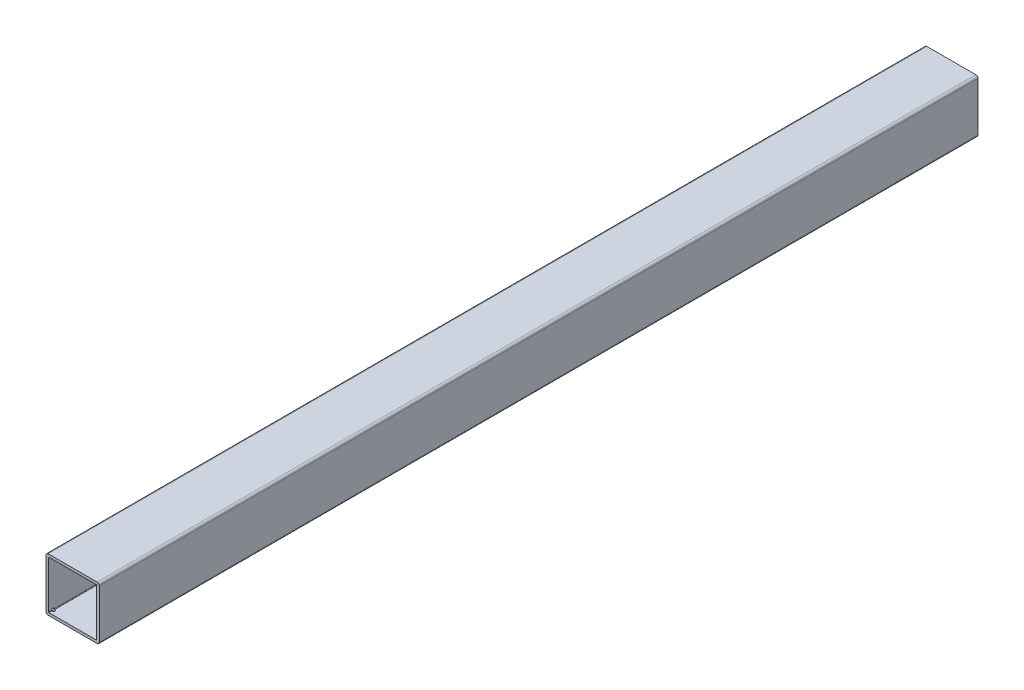
ISO-10303-21;
HEADER;
FILE_DESCRIPTION(('STEP AP214'),'2;1');
FILE_NAME('part.step','',(''),(''),'','','');
FILE_SCHEMA(('AUTOMOTIVE_DESIGN { 1 0 10303 214 1 1 1 1 }'));
ENDSEC;
DATA;
#1=APPLICATION_CONTEXT('core data for automotive mechanical design processes');
#2=APPLICATION_PROTOCOL_DEFINITION('international standard','automotive_design',2000,#1);
#3=PRODUCT_CONTEXT('',#1,'mechanical');
#4=PRODUCT('Part','Part','',(#3));
#5=PRODUCT_RELATED_PRODUCT_CATEGORY('part','',(#4));
#6=PRODUCT_DEFINITION_FORMATION('','',#4);
#7=PRODUCT_DEFINITION_CONTEXT('part definition',#1,'design');
#8=PRODUCT_DEFINITION('design','',#6,#7);
#9=PRODUCT_DEFINITION_SHAPE('','',#8);
#10=(LENGTH_UNIT() NAMED_UNIT(*) SI_UNIT(.MILLI.,.METRE.));
#11=(NAMED_UNIT(*) PLANE_ANGLE_UNIT() SI_UNIT($,.RADIAN.));
#12=(NAMED_UNIT(*) SI_UNIT($,.STERADIAN.) SOLID_ANGLE_UNIT());
#13=UNCERTAINTY_MEASURE_WITH_UNIT(LENGTH_MEASURE(1.E-05),#10,'distance_accuracy_value','');
#14=(GEOMETRIC_REPRESENTATION_CONTEXT(3) GLOBAL_UNCERTAINTY_ASSIGNED_CONTEXT((#13)) GLOBAL_UNIT_ASSIGNED_CONTEXT((#10,
#11,#12)) REPRESENTATION_CONTEXT('',''));
#15=CARTESIAN_POINT('',(0.,0.,0.));
#16=DIRECTION('',(0.,0.,1.));
#17=DIRECTION('',(1.,0.,0.));
#18=AXIS2_PLACEMENT_3D('',#15,#16,#17);
#19=CARTESIAN_POINT('',(-1270.,595.,-925.));
#20=DIRECTION('',(-1.,0.,0.));
#21=DIRECTION('',(0.,0.,1.));
#22=AXIS2_PLACEMENT_3D('',#19,#20,#21);
#23=PLANE('',#22);
#24=DIRECTION('',(0.,-1.,0.));
#25=VECTOR('',#24,1.);
#26=CARTESIAN_POINT('',(-1270.,508.,-819.4));
#27=LINE('',#26,#25);
#28=CARTESIAN_POINT('',(-1270.,506.,-819.4));
#29=VERTEX_POINT('',#28);
#30=CARTESIAN_POINT('',(-1270.,508.,-819.4));
#31=VERTEX_POINT('',#30);
#32=EDGE_CURVE('E413',#29,#31,#27,.F.);
#33=ORIENTED_EDGE('',*,*,#32,.F.);
#34=DIRECTION('',(0.,0.,1.));
#35=VECTOR('',#34,1.);
#36=CARTESIAN_POINT('',(-1270.,506.,-825.));
#37=LINE('',#36,#35);
#38=CARTESIAN_POINT('',(-1270.,506.,-825.));
#39=VERTEX_POINT('',#38);
#40=EDGE_CURVE('E448',#29,#39,#37,.F.);
#41=ORIENTED_EDGE('',*,*,#40,.T.);
#42=DIRECTION('',(0.,-1.,0.));
#43=VECTOR('',#42,1.);
#44=CARTESIAN_POINT('',(-1270.,100.,-825.));
#45=LINE('',#44,#43);
#46=CARTESIAN_POINT('',(-1270.,594.,-825.));
#47=VERTEX_POINT('',#46);
#48=EDGE_CURVE('E381',#47,#39,#45,.T.);
#49=ORIENTED_EDGE('',*,*,#48,.F.);
#50=DIRECTION('',(0.,0.,1.));
#51=VECTOR('',#50,1.);
#52=CARTESIAN_POINT('',(-1270.,594.,825.));
#53=LINE('',#52,#51);
#54=CARTESIAN_POINT('',(-1270.,594.,825.));
#55=VERTEX_POINT('',#54);
#56=EDGE_CURVE('E445',#47,#55,#53,.T.);
#57=ORIENTED_EDGE('',*,*,#56,.T.);
#58=DIRECTION('',(0.,1.,0.));
#59=VECTOR('',#58,1.);
#60=CARTESIAN_POINT('',(-1270.,100.,825.));
#61=LINE('',#60,#59);
#62=CARTESIAN_POINT('',(-1270.,506.,825.));
#63=VERTEX_POINT('',#62);
#64=EDGE_CURVE('E345',#63,#55,#61,.T.);
#65=ORIENTED_EDGE('',*,*,#64,.F.);
#66=CARTESIAN_POINT('',(-1270.,506.,819.4));
#67=VERTEX_POINT('',#66);
#68=EDGE_CURVE('E449',#63,#67,#37,.F.);
#69=ORIENTED_EDGE('',*,*,#68,.T.);
#70=DIRECTION('',(0.,-1.,0.));
#71=VECTOR('',#70,1.);
#72=CARTESIAN_POINT('',(-1270.,508.,819.4));
#73=LINE('',#72,#71);
#74=CARTESIAN_POINT('',(-1270.,508.,819.4));
#75=VERTEX_POINT('',#74);
#76=EDGE_CURVE('E199',#75,#67,#73,.T.);
#77=ORIENTED_EDGE('',*,*,#76,.F.);
#78=DIRECTION('',(0.,0.,1.));
#79=VECTOR('',#78,1.);
#80=CARTESIAN_POINT('',(-1270.,508.,-925.));
#81=LINE('',#80,#79);
#82=CARTESIAN_POINT('',(-1270.,508.,814.6));
#83=VERTEX_POINT('',#82);
#84=EDGE_CURVE('E27',#83,#75,#81,.T.);
#85=ORIENTED_EDGE('',*,*,#84,.F.);
#86=DIRECTION('',(0.,-1.,0.));
#87=VECTOR('',#86,1.);
#88=CARTESIAN_POINT('',(-1270.,508.,814.6));
#89=LINE('',#88,#87);
#90=CARTESIAN_POINT('',(-1270.,506.,814.6));
#91=VERTEX_POINT('',#90);
#92=EDGE_CURVE('E180',#91,#83,#89,.F.);
#93=ORIENTED_EDGE('',*,*,#92,.F.);
#94=CARTESIAN_POINT('',(-1270.,506.,-814.6));
#95=VERTEX_POINT('',#94);
#96=EDGE_CURVE('E415',#91,#95,#37,.F.);
#97=ORIENTED_EDGE('',*,*,#96,.T.);
#98=DIRECTION('',(0.,-1.,0.));
#99=VECTOR('',#98,1.);
#100=CARTESIAN_POINT('',(-1270.,508.,-814.6));
#101=LINE('',#100,#99);
#102=CARTESIAN_POINT('',(-1270.,508.,-814.6));
#103=VERTEX_POINT('',#102);
#104=EDGE_CURVE('E398',#103,#95,#101,.T.);
#105=ORIENTED_EDGE('',*,*,#104,.F.);
#106=DIRECTION('',(0.,0.,-1.));
#107=VECTOR('',#106,1.);
#108=CARTESIAN_POINT('',(-1270.,508.,-925.));
#109=LINE('',#108,#107);
#110=EDGE_CURVE('E12',#103,#31,#109,.T.);
#111=ORIENTED_EDGE('',*,*,#110,.T.);
#112=EDGE_LOOP('',(#33,#41,#49,#57,#65,#69,#77,#85,#93,#97,#105,#111));
#113=FACE_BOUND('',#112,.T.);
#114=ADVANCED_FACE('F19',(#113),#23,.F.);
#115=CARTESIAN_POINT('',(-1271.,504.,825.));
#116=DIRECTION('',(0.,0.,1.));
#117=DIRECTION('',(1.,0.,0.));
#118=AXIS2_PLACEMENT_3D('',#115,#116,#117);
#119=CYLINDRICAL_SURFACE('',#118,4.);
#120=DIRECTION('',(0.,0.,-1.));
#121=VECTOR('',#120,1.);
#122=CARTESIAN_POINT('',(-1271.,500.,-825.));
#123=LINE('',#122,#121);
#124=CARTESIAN_POINT('',(-1271.,500.,-818.661324772584));
#125=VERTEX_POINT('',#124);
#126=CARTESIAN_POINT('',(-1271.,500.,-825.));
#127=VERTEX_POINT('',#126);
#128=EDGE_CURVE('E294',#125,#127,#123,.T.);
#129=ORIENTED_EDGE('',*,*,#128,.F.);
#130=CARTESIAN_POINT('',(-1271.,500.,-818.661324772584));
#131=CARTESIAN_POINT('',(-1271.04662499454,500.000002773726,-818.605195062226));
#132=CARTESIAN_POINT('',(-1271.09085769348,500.000814596316,-818.547134918306));
#133=CARTESIAN_POINT('',(-1271.17427283019,500.003579997522,-818.427535082644));
#134=CARTESIAN_POINT('',(-1271.21345628017,500.005533346865,-818.365996091862));
#135=CARTESIAN_POINT('',(-1271.32297788215,500.012386882319,-818.176841294805));
#136=CARTESIAN_POINT('',(-1271.38539465559,500.018282732757,-818.044558106356));
#137=CARTESIAN_POINT('',(-1271.48719961571,500.02944845611,-817.771433379579));
#138=CARTESIAN_POINT('',(-1271.5265839814,500.034718225045,-817.630590425494));
#139=CARTESIAN_POINT('',(-1271.5812168886,500.042354461187,-817.344278951716));
#140=CARTESIAN_POINT('',(-1271.59648021106,500.044722706197,-817.198813320518));
#141=CARTESIAN_POINT('',(-1271.60242875833,500.045623870652,-816.907702429699));
#142=CARTESIAN_POINT('',(-1271.59316930317,500.044165422663,-816.762058313953));
#143=CARTESIAN_POINT('',(-1271.5504527553,500.037998473531,-816.474297706073));
#144=CARTESIAN_POINT('',(-1271.51697314742,500.033286948499,-816.33218462364));
#145=CARTESIAN_POINT('',(-1271.42685399839,500.022583750266,-816.055806342261));
#146=CARTESIAN_POINT('',(-1271.37024586477,500.016593818334,-815.9215307818));
#147=CARTESIAN_POINT('',(-1271.23547968072,500.006370595764,-815.664490637124));
#148=CARTESIAN_POINT('',(-1271.15737691937,500.002132867113,-815.541697588566));
#149=CARTESIAN_POINT('',(-1271.04709950854,500.000214063806,-815.396629787842));
#150=CARTESIAN_POINT('',(-1271.02385724197,500.000001052733,-815.3673881213));
#151=CARTESIAN_POINT('',(-1271.,500.,-815.338675227417));
#152=B_SPLINE_CURVE_WITH_KNOTS('',3,(#130,#131,#132,#133,#134,#135,#136,#137,#138,#139,#140,
#141,#142,#143,#144,#145,#146,#147,#148,#149,#150,#151),.UNSPECIFIED.,.F.,.F.,(4,2,2,2,2,2,2,2,
2,2,4),(0.,0.218755611716601,0.437467302000043,0.874392348785055,1.31138985930316,
1.74811948150027,2.1838647409998,2.62001559260321,3.05557612851102,3.49002660937734,
3.60204982101434),.UNSPECIFIED.);
#153=CARTESIAN_POINT('',(-1271.,500.,-815.338675227417));
#154=VERTEX_POINT('',#153);
#155=EDGE_CURVE('E296',#125,#154,#152,.T.);
#156=ORIENTED_EDGE('',*,*,#155,.T.);
#157=CARTESIAN_POINT('',(-1271.,500.,815.338675227417));
#158=VERTEX_POINT('',#157);
#159=EDGE_CURVE('E303',#158,#154,#123,.T.);
#160=ORIENTED_EDGE('',*,*,#159,.F.);
#161=CARTESIAN_POINT('',(-1271.,500.,815.338675227417));
#162=CARTESIAN_POINT('',(-1271.04662499454,500.000002773726,815.394804937775));
#163=CARTESIAN_POINT('',(-1271.09085769348,500.000814596316,815.452865081695));
#164=CARTESIAN_POINT('',(-1271.17427283019,500.003579997522,815.572464917357));
#165=CARTESIAN_POINT('',(-1271.21345628017,500.005533346865,815.634003908139));
#166=CARTESIAN_POINT('',(-1271.32297788215,500.012386882319,815.823158705195));
#167=CARTESIAN_POINT('',(-1271.38539465559,500.018282732757,815.955441893645));
#168=CARTESIAN_POINT('',(-1271.48719961571,500.02944845611,816.228566620421));
#169=CARTESIAN_POINT('',(-1271.5265839814,500.034718225045,816.369409574507));
#170=CARTESIAN_POINT('',(-1271.5812168886,500.042354461187,816.655721048284));
#171=CARTESIAN_POINT('',(-1271.59648021106,500.044722706197,816.801186679483));
#172=CARTESIAN_POINT('',(-1271.60242875833,500.045623870652,817.092297570301));
#173=CARTESIAN_POINT('',(-1271.59316930317,500.044165422663,817.237941686048));
#174=CARTESIAN_POINT('',(-1271.5504527553,500.037998473531,817.525702293928));
#175=CARTESIAN_POINT('',(-1271.51697314742,500.033286948499,817.667815376361));
#176=CARTESIAN_POINT('',(-1271.42685399839,500.022583750266,817.944193657739));
#177=CARTESIAN_POINT('',(-1271.37024586477,500.016593818334,818.078469218201));
#178=CARTESIAN_POINT('',(-1271.23547968072,500.006370595764,818.335509362877));
#179=CARTESIAN_POINT('',(-1271.15737691937,500.002132867113,818.458302411435));
#180=CARTESIAN_POINT('',(-1271.04709950854,500.000214063806,818.603370212158));
#181=CARTESIAN_POINT('',(-1271.02385724197,500.000001052733,818.632611878701));
#182=CARTESIAN_POINT('',(-1271.,500.,818.661324772584));
#183=B_SPLINE_CURVE_WITH_KNOTS('',3,(#161,#162,#163,#164,#165,#166,#167,#168,#169,#170,#171,
#172,#173,#174,#175,#176,#177,#178,#179,#180,#181,#182),.UNSPECIFIED.,.F.,.F.,(4,2,2,2,2,2,2,2,
2,2,4),(0.,0.218755611716601,0.437467302000043,0.874392348785055,1.31138985930284,
1.74811948150028,2.18386474099981,2.62001559260322,3.05557612851103,3.49002660937735,
3.60204982101435),.UNSPECIFIED.);
#184=CARTESIAN_POINT('',(-1271.,500.,818.661324772584));
#185=VERTEX_POINT('',#184);
#186=EDGE_CURVE('E225',#158,#185,#183,.T.);
#187=ORIENTED_EDGE('',*,*,#186,.T.);
#188=CARTESIAN_POINT('',(-1271.,500.,825.));
#189=VERTEX_POINT('',#188);
#190=EDGE_CURVE('E305',#189,#185,#123,.T.);
#191=ORIENTED_EDGE('',*,*,#190,.F.);
#192=CARTESIAN_POINT('',(-1271.,504.,825.));
#193=DIRECTION('',(0.,0.,-1.));
#194=DIRECTION('',(-1.,0.,0.));
#195=AXIS2_PLACEMENT_3D('',#192,#193,#194);
#196=CIRCLE('',#195,4.);
#197=CARTESIAN_POINT('',(-1275.,504.,825.));
#198=VERTEX_POINT('',#197);
#199=EDGE_CURVE('E422',#198,#189,#196,.F.);
#200=ORIENTED_EDGE('',*,*,#199,.F.);
#201=DIRECTION('',(0.,0.,-1.));
#202=VECTOR('',#201,1.);
#203=CARTESIAN_POINT('',(-1275.,504.,825.));
#204=LINE('',#203,#202);
#205=CARTESIAN_POINT('',(-1275.,504.,-825.));
#206=VERTEX_POINT('',#205);
#207=EDGE_CURVE('E423',#206,#198,#204,.F.);
#208=ORIENTED_EDGE('',*,*,#207,.F.);
#209=CARTESIAN_POINT('',(-1271.,504.,-825.));
#210=DIRECTION('',(0.,0.,1.));
#211=DIRECTION('',(1.,0.,0.));
#212=AXIS2_PLACEMENT_3D('',#209,#210,#211);
#213=CIRCLE('',#212,4.);
#214=EDGE_CURVE('E299',#127,#206,#213,.F.);
#215=ORIENTED_EDGE('',*,*,#214,.F.);
#216=EDGE_LOOP('',(#129,#156,#160,#187,#191,#200,#208,#215));
#217=FACE_BOUND('',#216,.T.);
#218=ADVANCED_FACE('F234',(#217),#119,.T.);
#219=CARTESIAN_POINT('',(-1269.,506.,-925.));
#220=DIRECTION('',(0.,0.,-1.));
#221=DIRECTION('',(-1.,0.,0.));
#222=AXIS2_PLACEMENT_3D('',#219,#220,#221);
#223=CYLINDRICAL_SURFACE('',#222,1.);
#224=CARTESIAN_POINT('',(-1270.,506.,-814.6));
#225=CARTESIAN_POINT('',(-1270.0000010608,505.972994214147,-814.600003330818));
#226=CARTESIAN_POINT('',(-1269.9989053241,505.946002562119,-814.599543605285));
#227=CARTESIAN_POINT('',(-1269.99454216188,505.892234894022,-814.597731426154));
#228=CARTESIAN_POINT('',(-1269.99127550235,505.865458805265,-814.596379287441));
#229=CARTESIAN_POINT('',(-1269.97829105853,505.785952573375,-814.591050309821));
#230=CARTESIAN_POINT('',(-1269.96538832776,505.733790890438,-814.585800287867));
#231=CARTESIAN_POINT('',(-1269.93159250057,505.632597455542,-814.572561172697));
#232=CARTESIAN_POINT('',(-1269.91070657435,505.583562940864,-814.564574538065));
#233=CARTESIAN_POINT('',(-1269.86159234319,505.489637971602,-814.546769558326));
#234=CARTESIAN_POINT('',(-1269.83335737766,505.444751326581,-814.536949553893));
#235=CARTESIAN_POINT('',(-1269.76878094534,505.358102449017,-814.516015474282));
#236=CARTESIAN_POINT('',(-1269.73211919262,505.31658845034,-814.504862158532));
#237=CARTESIAN_POINT('',(-1269.65240595484,505.240120132049,-814.482843942763));
#238=CARTESIAN_POINT('',(-1269.60935306116,505.205167262374,-814.47197910695));
#239=CARTESIAN_POINT('',(-1269.51615521284,505.141582866747,-814.45128633057));
#240=CARTESIAN_POINT('',(-1269.46580900352,505.113228078436,-814.441510596416));
#241=CARTESIAN_POINT('',(-1269.36063868312,505.065512951365,-814.424584042332));
#242=CARTESIAN_POINT('',(-1269.3058195087,505.046142850274,-814.417430375173));
#243=CARTESIAN_POINT('',(-1269.20900669045,505.021187107793,-814.408093688381));
#244=CARTESIAN_POINT('',(-1269.167680836,505.01326696,-814.405081882051));
#245=CARTESIAN_POINT('',(-1269.08424732282,505.002663431132,-814.401024372918));
#246=CARTESIAN_POINT('',(-1269.04213925445,504.999982876636,-814.399979731345));
#247=CARTESIAN_POINT('',(-1269.,505.,-814.4));
#248=B_SPLINE_CURVE_WITH_KNOTS('',3,(#224,#225,#226,#227,#228,#229,#230,#231,#232,#233,#234,
#235,#236,#237,#238,#239,#240,#241,#242,#243,#244,#245,#246,#247),.UNSPECIFIED.,.F.,.F.,(4,2,2,
2,2,2,2,2,2,2,2,4),(0.,0.0809638209627765,0.161899089418645,0.323019235343577,0.483995008242201,
0.645117187870362,0.813860986819894,0.982642032539791,1.15757298154704,1.33231341113014,
1.45850926056022,1.5847731695434),.UNSPECIFIED.);
#249=CARTESIAN_POINT('',(-1269.,505.,-814.4));
#250=VERTEX_POINT('',#249);
#251=EDGE_CURVE('E200',#95,#250,#248,.T.);
#252=ORIENTED_EDGE('',*,*,#251,.F.);
#253=ORIENTED_EDGE('',*,*,#96,.F.);
#254=CARTESIAN_POINT('',(-1269.,505.,814.4));
#255=CARTESIAN_POINT('',(-1269.02708075485,504.999999137207,814.399997739261));
#256=CARTESIAN_POINT('',(-1269.05414764753,505.001100776069,814.400423588729));
#257=CARTESIAN_POINT('',(-1269.10807021969,505.005488738495,814.402107280573));
#258=CARTESIAN_POINT('',(-1269.13492595628,505.008774449154,814.403364889537));
#259=CARTESIAN_POINT('',(-1269.21469966863,505.021841385053,814.408335413175));
#260=CARTESIAN_POINT('',(-1269.26705505041,505.034832820407,814.4132464399));
#261=CARTESIAN_POINT('',(-1269.36864831845,505.068886287683,814.42575741423));
#262=CARTESIAN_POINT('',(-1269.41788800843,505.089943599422,814.433355788989));
#263=CARTESIAN_POINT('',(-1269.51215863562,505.139459540218,814.450492018616));
#264=CARTESIAN_POINT('',(-1269.55718659663,505.167923350122,814.460031230078));
#265=CARTESIAN_POINT('',(-1269.64370806329,505.232746628897,814.480536471507));
#266=CARTESIAN_POINT('',(-1269.68499025298,505.269374717649,814.491544114334));
#267=CARTESIAN_POINT('',(-1269.76100292842,505.34892208698,814.513548105134));
#268=CARTESIAN_POINT('',(-1269.79573078798,505.391843877119,814.524544446832));
#269=CARTESIAN_POINT('',(-1269.85904327012,505.484889519729,814.545777587441));
#270=CARTESIAN_POINT('',(-1269.88731838037,505.535236202609,814.555964896562));
#271=CARTESIAN_POINT('',(-1269.93488282118,505.640395676329,814.573759672672));
#272=CARTESIAN_POINT('',(-1269.95418376774,505.695202585295,814.581370471158));
#273=CARTESIAN_POINT('',(-1269.97898363325,505.79183572109,814.591323924812));
#274=CARTESIAN_POINT('',(-1269.98683717922,505.832980225225,814.594546065646));
#275=CARTESIAN_POINT('',(-1269.99735655727,505.916071107467,814.598898496957));
#276=CARTESIAN_POINT('',(-1270.00001767663,505.958018179167,814.600026887069));
#277=CARTESIAN_POINT('',(-1270.,506.,814.6));
#278=B_SPLINE_CURVE_WITH_KNOTS('',3,(#254,#255,#256,#257,#258,#259,#260,#261,#262,#263,#264,
#265,#266,#267,#268,#269,#270,#271,#272,#273,#274,#275,#276,#277),.UNSPECIFIED.,.F.,.F.,(4,2,2,
2,2,2,2,2,2,2,2,4),(0.,0.081189480227277,0.16235618630781,0.324006172144191,0.485561703899264,
0.647230549015104,0.815318328520314,0.983473314771756,1.15850885009284,1.33331718767094,
1.4589878484893,1.58477251692345),.UNSPECIFIED.);
#279=CARTESIAN_POINT('',(-1269.,505.,814.4));
#280=VERTEX_POINT('',#279);
#281=EDGE_CURVE('E186',#280,#91,#278,.T.);
#282=ORIENTED_EDGE('',*,*,#281,.F.);
#283=DIRECTION('',(0.,0.,1.));
#284=VECTOR('',#283,1.);
#285=CARTESIAN_POINT('',(-1269.,505.,825.));
#286=LINE('',#285,#284);
#287=EDGE_CURVE('E443',#250,#280,#286,.T.);
#288=ORIENTED_EDGE('',*,*,#287,.F.);
#289=EDGE_LOOP('',(#252,#253,#282,#288));
#290=FACE_BOUND('',#289,.T.);
#291=ADVANCED_FACE('F262',(#290),#223,.F.);
#292=CARTESIAN_POINT('',(-1269.,505.,-819.6));
#293=CARTESIAN_POINT('',(-1269.02708075485,504.999999137207,-819.600002260739));
#294=CARTESIAN_POINT('',(-1269.05414764753,505.001100776069,-819.599576411271));
#295=CARTESIAN_POINT('',(-1269.10807021969,505.005488738495,-819.597892719427));
#296=CARTESIAN_POINT('',(-1269.13492595628,505.008774449154,-819.596635110464));
#297=CARTESIAN_POINT('',(-1269.21469966863,505.021841385053,-819.591664586825));
#298=CARTESIAN_POINT('',(-1269.26705505041,505.034832820407,-819.5867535601));
#299=CARTESIAN_POINT('',(-1269.36864831845,505.068886287683,-819.574242585771));
#300=CARTESIAN_POINT('',(-1269.41788800843,505.089943599422,-819.566644211012));
#301=CARTESIAN_POINT('',(-1269.51215863562,505.139459540218,-819.549507981384));
#302=CARTESIAN_POINT('',(-1269.55718659663,505.167923350122,-819.539968769923));
#303=CARTESIAN_POINT('',(-1269.64370806329,505.232746628897,-819.519463528493));
#304=CARTESIAN_POINT('',(-1269.68499025298,505.269374717649,-819.508455885666));
#305=CARTESIAN_POINT('',(-1269.76100292842,505.34892208698,-819.486451894866));
#306=CARTESIAN_POINT('',(-1269.79573078798,505.391843877119,-819.475455553169));
#307=CARTESIAN_POINT('',(-1269.85904327012,505.484889519729,-819.454222412559));
#308=CARTESIAN_POINT('',(-1269.88731838037,505.535236202609,-819.444035103439));
#309=CARTESIAN_POINT('',(-1269.93488282118,505.640395676329,-819.426240327328));
#310=CARTESIAN_POINT('',(-1269.95418376774,505.695202585295,-819.418629528843));
#311=CARTESIAN_POINT('',(-1269.97898363325,505.79183572109,-819.408676075188));
#312=CARTESIAN_POINT('',(-1269.98683717922,505.832980225225,-819.405453934355));
#313=CARTESIAN_POINT('',(-1269.99735655727,505.916071107467,-819.401101503044));
#314=CARTESIAN_POINT('',(-1270.00001767663,505.958018179167,-819.399973112932));
#315=CARTESIAN_POINT('',(-1270.,506.,-819.4));
#316=B_SPLINE_CURVE_WITH_KNOTS('',3,(#292,#293,#294,#295,#296,#297,#298,#299,#300,#301,#302,
#303,#304,#305,#306,#307,#308,#309,#310,#311,#312,#313,#314,#315),.UNSPECIFIED.,.F.,.F.,(4,2,2,
2,2,2,2,2,2,2,2,4),(0.,0.081189480227277,0.16235618630781,0.324006172144191,0.485561703899264,
0.647230549015104,0.815318328520151,0.98347331477173,1.15850885009281,1.33331718767091,
1.45898784848927,1.58477251692343),.UNSPECIFIED.);
#317=CARTESIAN_POINT('',(-1269.,505.,-819.6));
#318=VERTEX_POINT('',#317);
#319=EDGE_CURVE('E201',#318,#29,#316,.T.);
#320=ORIENTED_EDGE('',*,*,#319,.F.);
#321=CARTESIAN_POINT('',(-1269.,505.,-825.));
#322=VERTEX_POINT('',#321);
#323=EDGE_CURVE('E439',#322,#318,#286,.T.);
#324=ORIENTED_EDGE('',*,*,#323,.F.);
#325=CARTESIAN_POINT('',(-1269.,506.,-825.));
#326=DIRECTION('',(0.,0.,1.));
#327=DIRECTION('',(1.,0.,0.));
#328=AXIS2_PLACEMENT_3D('',#325,#326,#327);
#329=CIRCLE('',#328,1.);
#330=EDGE_CURVE('E462',#39,#322,#329,.T.);
#331=ORIENTED_EDGE('',*,*,#330,.F.);
#332=ORIENTED_EDGE('',*,*,#40,.F.);
#333=EDGE_LOOP('',(#320,#324,#331,#332));
#334=FACE_BOUND('',#333,.T.);
#335=ADVANCED_FACE('F266',(#334),#223,.F.);
#336=CARTESIAN_POINT('',(-1270.,506.,819.4));
#337=CARTESIAN_POINT('',(-1270.0000010608,505.972994214147,819.399996669182));
#338=CARTESIAN_POINT('',(-1269.9989053241,505.946002562119,819.400456394715));
#339=CARTESIAN_POINT('',(-1269.99454216188,505.892234894022,819.402268573846));
#340=CARTESIAN_POINT('',(-1269.99127550235,505.865458805265,819.40362071256));
#341=CARTESIAN_POINT('',(-1269.97829105853,505.785952573375,819.408949690179));
#342=CARTESIAN_POINT('',(-1269.96538832776,505.733790890438,819.414199712134));
#343=CARTESIAN_POINT('',(-1269.93159250057,505.632597455542,819.427438827303));
#344=CARTESIAN_POINT('',(-1269.91070657435,505.583562940864,819.435425461936));
#345=CARTESIAN_POINT('',(-1269.86159234319,505.489637971602,819.453230441675));
#346=CARTESIAN_POINT('',(-1269.83335737766,505.444751326581,819.463050446108));
#347=CARTESIAN_POINT('',(-1269.76878094534,505.358102449017,819.483984525718));
#348=CARTESIAN_POINT('',(-1269.73211919262,505.31658845034,819.495137841468));
#349=CARTESIAN_POINT('',(-1269.65240595484,505.240120132049,819.517156057237));
#350=CARTESIAN_POINT('',(-1269.60935306116,505.205167262374,819.52802089305));
#351=CARTESIAN_POINT('',(-1269.51615521284,505.141582866747,819.54871366943));
#352=CARTESIAN_POINT('',(-1269.46580900352,505.113228078436,819.558489403585));
#353=CARTESIAN_POINT('',(-1269.36063868312,505.065512951365,819.575415957668));
#354=CARTESIAN_POINT('',(-1269.3058195087,505.046142850274,819.582569624827));
#355=CARTESIAN_POINT('',(-1269.20900669045,505.021187107793,819.591906311619));
#356=CARTESIAN_POINT('',(-1269.167680836,505.01326696,819.59491811795));
#357=CARTESIAN_POINT('',(-1269.08424732282,505.002663431132,819.598975627083));
#358=CARTESIAN_POINT('',(-1269.04213925445,504.999982876636,819.600020268656));
#359=CARTESIAN_POINT('',(-1269.,505.,819.6));
#360=B_SPLINE_CURVE_WITH_KNOTS('',3,(#336,#337,#338,#339,#340,#341,#342,#343,#344,#345,#346,
#347,#348,#349,#350,#351,#352,#353,#354,#355,#356,#357,#358,#359),.UNSPECIFIED.,.F.,.F.,(4,2,2,
2,2,2,2,2,2,2,2,4),(0.,0.0809638209627765,0.161899089418645,0.323019235343577,0.483995008242302,
0.64511718787037,0.813860986819903,0.9826420325398,1.15757298154705,1.33231341113014,
1.45850926056023,1.58477316954341),.UNSPECIFIED.);
#361=CARTESIAN_POINT('',(-1269.,505.,819.6));
#362=VERTEX_POINT('',#361);
#363=EDGE_CURVE('E253',#67,#362,#360,.T.);
#364=ORIENTED_EDGE('',*,*,#363,.F.);
#365=ORIENTED_EDGE('',*,*,#68,.F.);
#366=CARTESIAN_POINT('',(-1269.,506.,825.));
#367=DIRECTION('',(0.,0.,-1.));
#368=DIRECTION('',(-1.,0.,0.));
#369=AXIS2_PLACEMENT_3D('',#366,#367,#368);
#370=CIRCLE('',#369,1.);
#371=CARTESIAN_POINT('',(-1269.,505.,825.));
#372=VERTEX_POINT('',#371);
#373=EDGE_CURVE('E460',#372,#63,#370,.T.);
#374=ORIENTED_EDGE('',*,*,#373,.F.);
#375=EDGE_CURVE('E438',#362,#372,#286,.T.);
#376=ORIENTED_EDGE('',*,*,#375,.F.);
#377=EDGE_LOOP('',(#364,#365,#374,#376));
#378=FACE_BOUND('',#377,.T.);
#379=ADVANCED_FACE('F268',(#378),#223,.F.);
#380=CARTESIAN_POINT('',(-1175.,100.,825.));
#381=DIRECTION('',(1.,0.,0.));
#382=DIRECTION('',(0.,0.,-1.));
#383=AXIS2_PLACEMENT_3D('',#380,#381,#382);
#384=PLANE('',#383);
#385=DIRECTION('',(0.,0.,-1.));
#386=VECTOR('',#385,1.);
#387=CARTESIAN_POINT('',(-1175.,596.,825.));
#388=LINE('',#387,#386);
#389=CARTESIAN_POINT('',(-1175.,596.,-825.));
#390=VERTEX_POINT('',#389);
#391=CARTESIAN_POINT('',(-1175.,596.,825.));
#392=VERTEX_POINT('',#391);
#393=EDGE_CURVE('E340',#390,#392,#388,.F.);
#394=ORIENTED_EDGE('',*,*,#393,.T.);
#395=DIRECTION('',(0.,1.,0.));
#396=VECTOR('',#395,1.);
#397=CARTESIAN_POINT('',(-1175.,500.,825.));
#398=LINE('',#397,#396);
#399=CARTESIAN_POINT('',(-1175.,504.,825.));
#400=VERTEX_POINT('',#399);
#401=EDGE_CURVE('E360',#392,#400,#398,.F.);
#402=ORIENTED_EDGE('',*,*,#401,.T.);
#403=DIRECTION('',(0.,0.,-1.));
#404=VECTOR('',#403,1.);
#405=CARTESIAN_POINT('',(-1175.,504.,825.));
#406=LINE('',#405,#404);
#407=CARTESIAN_POINT('',(-1175.,504.,-825.));
#408=VERTEX_POINT('',#407);
#409=EDGE_CURVE('E306',#400,#408,#406,.T.);
#410=ORIENTED_EDGE('',*,*,#409,.T.);
#411=DIRECTION('',(0.,1.,0.));
#412=VECTOR('',#411,1.);
#413=CARTESIAN_POINT('',(-1175.,500.,-825.));
#414=LINE('',#413,#412);
#415=EDGE_CURVE('E364',#408,#390,#414,.T.);
#416=ORIENTED_EDGE('',*,*,#415,.T.);
#417=EDGE_LOOP('',(#394,#402,#410,#416));
#418=FACE_BOUND('',#417,.T.);
#419=ADVANCED_FACE('F511',(#418),#384,.T.);
#420=CARTESIAN_POINT('',(-358.3,500.,825.));
#421=DIRECTION('',(0.,-1.,0.));
#422=DIRECTION('',(0.,0.,-1.));
#423=AXIS2_PLACEMENT_3D('',#420,#421,#422);
#424=PLANE('',#423);
#425=ORIENTED_EDGE('',*,*,#159,.T.);
#426=CARTESIAN_POINT('',(-1269.,500.,-817.));
#427=DIRECTION('',(0.,-1.,0.));
#428=DIRECTION('',(0.,0.,-1.));
#429=AXIS2_PLACEMENT_3D('',#426,#427,#428);
#430=CIRCLE('',#429,2.59999999999994);
#431=EDGE_CURVE('E33',#154,#125,#430,.F.);
#432=ORIENTED_EDGE('',*,*,#431,.T.);
#433=ORIENTED_EDGE('',*,*,#128,.T.);
#434=DIRECTION('',(-1.,0.,0.));
#435=VECTOR('',#434,1.);
#436=CARTESIAN_POINT('',(-1175.,500.,-825.));
#437=LINE('',#436,#435);
#438=CARTESIAN_POINT('',(-1179.,500.,-825.));
#439=VERTEX_POINT('',#438);
#440=EDGE_CURVE('E354',#127,#439,#437,.F.);
#441=ORIENTED_EDGE('',*,*,#440,.T.);
#442=DIRECTION('',(0.,0.,-1.));
#443=VECTOR('',#442,1.);
#444=CARTESIAN_POINT('',(-1179.,500.,825.));
#445=LINE('',#444,#443);
#446=CARTESIAN_POINT('',(-1179.,500.,825.));
#447=VERTEX_POINT('',#446);
#448=EDGE_CURVE('E304',#439,#447,#445,.F.);
#449=ORIENTED_EDGE('',*,*,#448,.T.);
#450=DIRECTION('',(1.,0.,0.));
#451=VECTOR('',#450,1.);
#452=CARTESIAN_POINT('',(0.,500.,825.));
#453=LINE('',#452,#451);
#454=EDGE_CURVE('E359',#189,#447,#453,.T.);
#455=ORIENTED_EDGE('',*,*,#454,.F.);
#456=ORIENTED_EDGE('',*,*,#190,.T.);
#457=CARTESIAN_POINT('',(-1269.,500.,817.));
#458=DIRECTION('',(0.,-1.,0.));
#459=DIRECTION('',(0.,0.,-1.));
#460=AXIS2_PLACEMENT_3D('',#457,#458,#459);
#461=CIRCLE('',#460,2.59999999999994);
#462=EDGE_CURVE('E40',#185,#158,#461,.F.);
#463=ORIENTED_EDGE('',*,*,#462,.T.);
#464=EDGE_LOOP('',(#425,#432,#433,#441,#449,#455,#456,#463));
#465=FACE_BOUND('',#464,.T.);
#466=ADVANCED_FACE('F420',(#465),#424,.T.);
#467=CARTESIAN_POINT('',(-1175.,100.,-825.));
#468=DIRECTION('',(0.,0.,1.));
#469=DIRECTION('',(1.,0.,0.));
#470=AXIS2_PLACEMENT_3D('',#467,#468,#469);
#471=PLANE('',#470);
#472=DIRECTION('',(-1.,0.,0.));
#473=VECTOR('',#472,1.);
#474=CARTESIAN_POINT('',(-1175.,595.,-825.));
#475=LINE('',#474,#473);
#476=CARTESIAN_POINT('',(-1181.,595.,-825.));
#477=VERTEX_POINT('',#476);
#478=CARTESIAN_POINT('',(-1269.,595.,-825.));
#479=VERTEX_POINT('',#478);
#480=EDGE_CURVE('E384',#477,#479,#475,.T.);
#481=ORIENTED_EDGE('',*,*,#480,.T.);
#482=CARTESIAN_POINT('',(-1269.,594.,-825.));
#483=DIRECTION('',(0.,0.,1.));
#484=DIRECTION('',(1.,0.,0.));
#485=AXIS2_PLACEMENT_3D('',#482,#483,#484);
#486=CIRCLE('',#485,1.);
#487=EDGE_CURVE('E466',#479,#47,#486,.T.);
#488=ORIENTED_EDGE('',*,*,#487,.T.);
#489=ORIENTED_EDGE('',*,*,#48,.T.);
#490=ORIENTED_EDGE('',*,*,#330,.T.);
#491=DIRECTION('',(1.,0.,0.));
#492=VECTOR('',#491,1.);
#493=CARTESIAN_POINT('',(-1175.,505.,-825.));
#494=LINE('',#493,#492);
#495=CARTESIAN_POINT('',(-1181.,505.,-825.));
#496=VERTEX_POINT('',#495);
#497=EDGE_CURVE('E374',#322,#496,#494,.T.);
#498=ORIENTED_EDGE('',*,*,#497,.T.);
#499=CARTESIAN_POINT('',(-1181.,506.,-825.));
#500=DIRECTION('',(0.,0.,1.));
#501=DIRECTION('',(1.,0.,0.));
#502=AXIS2_PLACEMENT_3D('',#499,#500,#501);
#503=CIRCLE('',#502,1.);
#504=CARTESIAN_POINT('',(-1180.,506.,-825.));
#505=VERTEX_POINT('',#504);
#506=EDGE_CURVE('E458',#496,#505,#503,.T.);
#507=ORIENTED_EDGE('',*,*,#506,.T.);
#508=DIRECTION('',(0.,1.,0.));
#509=VECTOR('',#508,1.);
#510=CARTESIAN_POINT('',(-1180.,100.,-825.));
#511=LINE('',#510,#509);
#512=CARTESIAN_POINT('',(-1180.,594.,-825.));
#513=VERTEX_POINT('',#512);
#514=EDGE_CURVE('E388',#505,#513,#511,.T.);
#515=ORIENTED_EDGE('',*,*,#514,.T.);
#516=CARTESIAN_POINT('',(-1181.,594.,-825.));
#517=DIRECTION('',(0.,0.,1.));
#518=DIRECTION('',(1.,0.,0.));
#519=AXIS2_PLACEMENT_3D('',#516,#517,#518);
#520=CIRCLE('',#519,1.);
#521=EDGE_CURVE('E469',#513,#477,#520,.T.);
#522=ORIENTED_EDGE('',*,*,#521,.T.);
#523=EDGE_LOOP('',(#481,#488,#489,#490,#498,#507,#515,#522));
#524=FACE_BOUND('',#523,.T.);
#525=ORIENTED_EDGE('',*,*,#415,.F.);
#526=CARTESIAN_POINT('',(-1179.,504.,-825.));
#527=DIRECTION('',(0.,0.,1.));
#528=DIRECTION('',(1.,0.,0.));
#529=AXIS2_PLACEMENT_3D('',#526,#527,#528);
#530=CIRCLE('',#529,4.);
#531=EDGE_CURVE('E324',#408,#439,#530,.F.);
#532=ORIENTED_EDGE('',*,*,#531,.T.);
#533=ORIENTED_EDGE('',*,*,#440,.F.);
#534=ORIENTED_EDGE('',*,*,#214,.T.);
#535=DIRECTION('',(0.,-1.,0.));
#536=VECTOR('',#535,1.);
#537=CARTESIAN_POINT('',(-1275.,500.,-825.));
#538=LINE('',#537,#536);
#539=CARTESIAN_POINT('',(-1275.,596.,-825.));
#540=VERTEX_POINT('',#539);
#541=EDGE_CURVE('E358',#540,#206,#538,.T.);
#542=ORIENTED_EDGE('',*,*,#541,.F.);
#543=CARTESIAN_POINT('',(-1271.,596.,-825.));
#544=DIRECTION('',(0.,0.,1.));
#545=DIRECTION('',(1.,0.,0.));
#546=AXIS2_PLACEMENT_3D('',#543,#544,#545);
#547=CIRCLE('',#546,4.);
#548=CARTESIAN_POINT('',(-1271.,600.,-825.));
#549=VERTEX_POINT('',#548);
#550=EDGE_CURVE('E311',#540,#549,#547,.F.);
#551=ORIENTED_EDGE('',*,*,#550,.T.);
#552=DIRECTION('',(1.,0.,0.));
#553=VECTOR('',#552,1.);
#554=CARTESIAN_POINT('',(-1275.,600.,-825.));
#555=LINE('',#554,#553);
#556=CARTESIAN_POINT('',(-1179.,600.,-825.));
#557=VERTEX_POINT('',#556);
#558=EDGE_CURVE('E363',#549,#557,#555,.T.);
#559=ORIENTED_EDGE('',*,*,#558,.T.);
#560=CARTESIAN_POINT('',(-1179.,596.,-825.));
#561=DIRECTION('',(0.,0.,1.));
#562=DIRECTION('',(1.,0.,0.));
#563=AXIS2_PLACEMENT_3D('',#560,#561,#562);
#564=CIRCLE('',#563,4.);
#565=EDGE_CURVE('E319',#557,#390,#564,.F.);
#566=ORIENTED_EDGE('',*,*,#565,.T.);
#567=EDGE_LOOP('',(#525,#532,#533,#534,#542,#551,#559,#566));
#568=FACE_BOUND('',#567,.T.);
#569=ADVANCED_FACE('F473',(#524,#568),#471,.F.);
#570=CARTESIAN_POINT('',(-1275.,600.,50.));
#571=DIRECTION('',(0.,1.,0.));
#572=DIRECTION('',(0.,0.,1.));
#573=AXIS2_PLACEMENT_3D('',#570,#571,#572);
#574=PLANE('',#573);
#575=ORIENTED_EDGE('',*,*,#558,.F.);
#576=DIRECTION('',(0.,0.,1.));
#577=VECTOR('',#576,1.);
#578=CARTESIAN_POINT('',(-1271.,600.,825.));
#579=LINE('',#578,#577);
#580=CARTESIAN_POINT('',(-1271.,600.,825.));
#581=VERTEX_POINT('',#580);
#582=EDGE_CURVE('E330',#549,#581,#579,.T.);
#583=ORIENTED_EDGE('',*,*,#582,.T.);
#584=DIRECTION('',(-1.,0.,0.));
#585=VECTOR('',#584,1.);
#586=CARTESIAN_POINT('',(-1275.,600.,825.));
#587=LINE('',#586,#585);
#588=CARTESIAN_POINT('',(-1179.,600.,825.));
#589=VERTEX_POINT('',#588);
#590=EDGE_CURVE('E366',#589,#581,#587,.T.);
#591=ORIENTED_EDGE('',*,*,#590,.F.);
#592=DIRECTION('',(0.,0.,-1.));
#593=VECTOR('',#592,1.);
#594=CARTESIAN_POINT('',(-1179.,600.,50.));
#595=LINE('',#594,#593);
#596=EDGE_CURVE('E327',#589,#557,#595,.T.);
#597=ORIENTED_EDGE('',*,*,#596,.T.);
#598=EDGE_LOOP('',(#575,#583,#591,#597));
#599=FACE_BOUND('',#598,.T.);
#600=ADVANCED_FACE('F524',(#599),#574,.T.);
#601=CARTESIAN_POINT('',(-1275.,100.,825.));
#602=DIRECTION('',(0.,0.,-1.));
#603=DIRECTION('',(-1.,0.,0.));
#604=AXIS2_PLACEMENT_3D('',#601,#602,#603);
#605=PLANE('',#604);
#606=DIRECTION('',(1.,0.,0.));
#607=VECTOR('',#606,1.);
#608=CARTESIAN_POINT('',(-1275.,595.,825.));
#609=LINE('',#608,#607);
#610=CARTESIAN_POINT('',(-1269.,595.,825.));
#611=VERTEX_POINT('',#610);
#612=CARTESIAN_POINT('',(-1181.,595.,825.));
#613=VERTEX_POINT('',#612);
#614=EDGE_CURVE('E347',#611,#613,#609,.T.);
#615=ORIENTED_EDGE('',*,*,#614,.T.);
#616=CARTESIAN_POINT('',(-1181.,594.,825.));
#617=DIRECTION('',(0.,0.,-1.));
#618=DIRECTION('',(-1.,0.,0.));
#619=AXIS2_PLACEMENT_3D('',#616,#617,#618);
#620=CIRCLE('',#619,1.);
#621=CARTESIAN_POINT('',(-1180.,594.,825.));
#622=VERTEX_POINT('',#621);
#623=EDGE_CURVE('E468',#613,#622,#620,.T.);
#624=ORIENTED_EDGE('',*,*,#623,.T.);
#625=DIRECTION('',(0.,-1.,0.));
#626=VECTOR('',#625,1.);
#627=CARTESIAN_POINT('',(-1180.,100.,825.));
#628=LINE('',#627,#626);
#629=CARTESIAN_POINT('',(-1180.,506.,825.));
#630=VERTEX_POINT('',#629);
#631=EDGE_CURVE('E351',#622,#630,#628,.T.);
#632=ORIENTED_EDGE('',*,*,#631,.T.);
#633=CARTESIAN_POINT('',(-1181.,506.,825.));
#634=DIRECTION('',(0.,0.,-1.));
#635=DIRECTION('',(-1.,0.,0.));
#636=AXIS2_PLACEMENT_3D('',#633,#634,#635);
#637=CIRCLE('',#636,1.);
#638=CARTESIAN_POINT('',(-1181.,505.,825.));
#639=VERTEX_POINT('',#638);
#640=EDGE_CURVE('E456',#630,#639,#637,.T.);
#641=ORIENTED_EDGE('',*,*,#640,.T.);
#642=DIRECTION('',(-1.,0.,0.));
#643=VECTOR('',#642,1.);
#644=CARTESIAN_POINT('',(-1275.,505.,825.));
#645=LINE('',#644,#643);
#646=EDGE_CURVE('E342',#639,#372,#645,.T.);
#647=ORIENTED_EDGE('',*,*,#646,.T.);
#648=ORIENTED_EDGE('',*,*,#373,.T.);
#649=ORIENTED_EDGE('',*,*,#64,.T.);
#650=CARTESIAN_POINT('',(-1269.,594.,825.));
#651=DIRECTION('',(0.,0.,-1.));
#652=DIRECTION('',(-1.,0.,0.));
#653=AXIS2_PLACEMENT_3D('',#650,#651,#652);
#654=CIRCLE('',#653,1.);
#655=EDGE_CURVE('E464',#55,#611,#654,.T.);
#656=ORIENTED_EDGE('',*,*,#655,.T.);
#657=EDGE_LOOP('',(#615,#624,#632,#641,#647,#648,#649,#656));
#658=FACE_BOUND('',#657,.T.);
#659=DIRECTION('',(0.,1.,0.));
#660=VECTOR('',#659,1.);
#661=CARTESIAN_POINT('',(-1275.,500.,825.));
#662=LINE('',#661,#660);
#663=CARTESIAN_POINT('',(-1275.,596.,825.));
#664=VERTEX_POINT('',#663);
#665=EDGE_CURVE('E355',#198,#664,#662,.T.);
#666=ORIENTED_EDGE('',*,*,#665,.F.);
#667=ORIENTED_EDGE('',*,*,#199,.T.);
#668=ORIENTED_EDGE('',*,*,#454,.T.);
#669=CARTESIAN_POINT('',(-1179.,504.,825.));
#670=DIRECTION('',(0.,0.,-1.));
#671=DIRECTION('',(-1.,0.,0.));
#672=AXIS2_PLACEMENT_3D('',#669,#670,#671);
#673=CIRCLE('',#672,4.);
#674=EDGE_CURVE('E427',#447,#400,#673,.F.);
#675=ORIENTED_EDGE('',*,*,#674,.T.);
#676=ORIENTED_EDGE('',*,*,#401,.F.);
#677=CARTESIAN_POINT('',(-1179.,596.,825.));
#678=DIRECTION('',(0.,0.,-1.));
#679=DIRECTION('',(-1.,0.,0.));
#680=AXIS2_PLACEMENT_3D('',#677,#678,#679);
#681=CIRCLE('',#680,4.);
#682=EDGE_CURVE('E544',#392,#589,#681,.F.);
#683=ORIENTED_EDGE('',*,*,#682,.T.);
#684=ORIENTED_EDGE('',*,*,#590,.T.);
#685=CARTESIAN_POINT('',(-1271.,596.,825.));
#686=DIRECTION('',(0.,0.,-1.));
#687=DIRECTION('',(-1.,0.,0.));
#688=AXIS2_PLACEMENT_3D('',#685,#686,#687);
#689=CIRCLE('',#688,4.);
#690=EDGE_CURVE('E432',#581,#664,#689,.F.);
#691=ORIENTED_EDGE('',*,*,#690,.T.);
#692=EDGE_LOOP('',(#666,#667,#668,#675,#676,#683,#684,#691));
#693=FACE_BOUND('',#692,.T.);
#694=ADVANCED_FACE('F483',(#658,#693),#605,.F.);
#695=CARTESIAN_POINT('',(-1275.,500.,0.));
#696=DIRECTION('',(1.,0.,0.));
#697=DIRECTION('',(0.,0.,-1.));
#698=AXIS2_PLACEMENT_3D('',#695,#696,#697);
#699=PLANE('',#698);
#700=ORIENTED_EDGE('',*,*,#541,.T.);
#701=ORIENTED_EDGE('',*,*,#207,.T.);
#702=ORIENTED_EDGE('',*,*,#665,.T.);
#703=DIRECTION('',(0.,0.,1.));
#704=VECTOR('',#703,1.);
#705=CARTESIAN_POINT('',(-1275.,596.,-825.));
#706=LINE('',#705,#704);
#707=EDGE_CURVE('E549',#664,#540,#706,.F.);
#708=ORIENTED_EDGE('',*,*,#707,.T.);
#709=EDGE_LOOP('',(#700,#701,#702,#708));
#710=FACE_BOUND('',#709,.T.);
#711=ADVANCED_FACE('F521',(#710),#699,.F.);
#712=CARTESIAN_POINT('',(-1270.,505.,-925.));
#713=DIRECTION('',(0.,-1.,0.));
#714=DIRECTION('',(0.,0.,-1.));
#715=AXIS2_PLACEMENT_3D('',#712,#713,#714);
#716=PLANE('',#715);
#717=CARTESIAN_POINT('',(-1269.,505.,-817.));
#718=DIRECTION('',(0.,-1.,0.));
#719=DIRECTION('',(0.,0.,-1.));
#720=AXIS2_PLACEMENT_3D('',#717,#718,#719);
#721=CIRCLE('',#720,2.59999999999994);
#722=EDGE_CURVE('E417',#250,#318,#721,.F.);
#723=ORIENTED_EDGE('',*,*,#722,.F.);
#724=ORIENTED_EDGE('',*,*,#287,.T.);
#725=CARTESIAN_POINT('',(-1269.,505.,817.));
#726=DIRECTION('',(0.,-1.,0.));
#727=DIRECTION('',(0.,0.,-1.));
#728=AXIS2_PLACEMENT_3D('',#725,#726,#727);
#729=CIRCLE('',#728,2.59999999999994);
#730=EDGE_CURVE('E191',#362,#280,#729,.F.);
#731=ORIENTED_EDGE('',*,*,#730,.F.);
#732=ORIENTED_EDGE('',*,*,#375,.T.);
#733=ORIENTED_EDGE('',*,*,#646,.F.);
#734=DIRECTION('',(0.,0.,1.));
#735=VECTOR('',#734,1.);
#736=CARTESIAN_POINT('',(-1181.,505.,-825.));
#737=LINE('',#736,#735);
#738=EDGE_CURVE('E442',#639,#496,#737,.F.);
#739=ORIENTED_EDGE('',*,*,#738,.T.);
#740=ORIENTED_EDGE('',*,*,#497,.F.);
#741=ORIENTED_EDGE('',*,*,#323,.T.);
#742=EDGE_LOOP('',(#723,#724,#731,#732,#733,#739,#740,#741));
#743=FACE_BOUND('',#742,.T.);
#744=ADVANCED_FACE('F491',(#743),#716,.F.);
#745=CARTESIAN_POINT('',(-1180.,595.,-925.));
#746=DIRECTION('',(0.,1.,0.));
#747=DIRECTION('',(0.,0.,1.));
#748=AXIS2_PLACEMENT_3D('',#745,#746,#747);
#749=PLANE('',#748);
#750=ORIENTED_EDGE('',*,*,#614,.F.);
#751=DIRECTION('',(0.,0.,1.));
#752=VECTOR('',#751,1.);
#753=CARTESIAN_POINT('',(-1269.,595.,-825.));
#754=LINE('',#753,#752);
#755=EDGE_CURVE('E454',#611,#479,#754,.F.);
#756=ORIENTED_EDGE('',*,*,#755,.T.);
#757=ORIENTED_EDGE('',*,*,#480,.F.);
#758=DIRECTION('',(0.,0.,1.));
#759=VECTOR('',#758,1.);
#760=CARTESIAN_POINT('',(-1181.,595.,825.));
#761=LINE('',#760,#759);
#762=EDGE_CURVE('E451',#477,#613,#761,.T.);
#763=ORIENTED_EDGE('',*,*,#762,.T.);
#764=EDGE_LOOP('',(#750,#756,#757,#763));
#765=FACE_BOUND('',#764,.T.);
#766=ADVANCED_FACE('F479',(#765),#749,.F.);
#767=CARTESIAN_POINT('',(-1180.,505.,-925.));
#768=DIRECTION('',(1.,0.,0.));
#769=DIRECTION('',(0.,0.,-1.));
#770=AXIS2_PLACEMENT_3D('',#767,#768,#769);
#771=PLANE('',#770);
#772=ORIENTED_EDGE('',*,*,#514,.F.);
#773=DIRECTION('',(0.,0.,1.));
#774=VECTOR('',#773,1.);
#775=CARTESIAN_POINT('',(-1180.,506.,825.));
#776=LINE('',#775,#774);
#777=EDGE_CURVE('E429',#505,#630,#776,.T.);
#778=ORIENTED_EDGE('',*,*,#777,.T.);
#779=ORIENTED_EDGE('',*,*,#631,.F.);
#780=DIRECTION('',(0.,0.,1.));
#781=VECTOR('',#780,1.);
#782=CARTESIAN_POINT('',(-1180.,594.,-825.));
#783=LINE('',#782,#781);
#784=EDGE_CURVE('E426',#622,#513,#783,.F.);
#785=ORIENTED_EDGE('',*,*,#784,.T.);
#786=EDGE_LOOP('',(#772,#778,#779,#785));
#787=FACE_BOUND('',#786,.T.);
#788=ADVANCED_FACE('F485',(#787),#771,.F.);
#789=CARTESIAN_POINT('',(-1179.,504.,825.));
#790=DIRECTION('',(0.,0.,-1.));
#791=DIRECTION('',(-1.,0.,0.));
#792=AXIS2_PLACEMENT_3D('',#789,#790,#791);
#793=CYLINDRICAL_SURFACE('',#792,4.);
#794=ORIENTED_EDGE('',*,*,#674,.F.);
#795=ORIENTED_EDGE('',*,*,#448,.F.);
#796=ORIENTED_EDGE('',*,*,#531,.F.);
#797=ORIENTED_EDGE('',*,*,#409,.F.);
#798=EDGE_LOOP('',(#794,#795,#796,#797));
#799=FACE_BOUND('',#798,.T.);
#800=ADVANCED_FACE('F532',(#799),#793,.T.);
#801=CARTESIAN_POINT('',(-1179.,596.,50.));
#802=DIRECTION('',(0.,0.,-1.));
#803=DIRECTION('',(-1.,0.,0.));
#804=AXIS2_PLACEMENT_3D('',#801,#802,#803);
#805=CYLINDRICAL_SURFACE('',#804,4.);
#806=ORIENTED_EDGE('',*,*,#682,.F.);
#807=ORIENTED_EDGE('',*,*,#393,.F.);
#808=ORIENTED_EDGE('',*,*,#565,.F.);
#809=ORIENTED_EDGE('',*,*,#596,.F.);
#810=EDGE_LOOP('',(#806,#807,#808,#809));
#811=FACE_BOUND('',#810,.T.);
#812=ADVANCED_FACE('F534',(#811),#805,.T.);
#813=CARTESIAN_POINT('',(-1271.,596.,50.));
#814=DIRECTION('',(0.,0.,-1.));
#815=DIRECTION('',(-1.,0.,0.));
#816=AXIS2_PLACEMENT_3D('',#813,#814,#815);
#817=CYLINDRICAL_SURFACE('',#816,4.);
#818=ORIENTED_EDGE('',*,*,#550,.F.);
#819=ORIENTED_EDGE('',*,*,#707,.F.);
#820=ORIENTED_EDGE('',*,*,#690,.F.);
#821=ORIENTED_EDGE('',*,*,#582,.F.);
#822=EDGE_LOOP('',(#818,#819,#820,#821));
#823=FACE_BOUND('',#822,.T.);
#824=ADVANCED_FACE('F282',(#823),#817,.T.);
#825=CARTESIAN_POINT('',(-1181.,506.,-925.));
#826=DIRECTION('',(0.,0.,-1.));
#827=DIRECTION('',(-1.,0.,0.));
#828=AXIS2_PLACEMENT_3D('',#825,#826,#827);
#829=CYLINDRICAL_SURFACE('',#828,1.);
#830=ORIENTED_EDGE('',*,*,#506,.F.);
#831=ORIENTED_EDGE('',*,*,#738,.F.);
#832=ORIENTED_EDGE('',*,*,#640,.F.);
#833=ORIENTED_EDGE('',*,*,#777,.F.);
#834=EDGE_LOOP('',(#830,#831,#832,#833));
#835=FACE_BOUND('',#834,.T.);
#836=ADVANCED_FACE('F269',(#835),#829,.F.);
#837=CARTESIAN_POINT('',(-1269.,594.,-925.));
#838=DIRECTION('',(0.,0.,-1.));
#839=DIRECTION('',(-1.,0.,0.));
#840=AXIS2_PLACEMENT_3D('',#837,#838,#839);
#841=CYLINDRICAL_SURFACE('',#840,1.);
#842=ORIENTED_EDGE('',*,*,#487,.F.);
#843=ORIENTED_EDGE('',*,*,#755,.F.);
#844=ORIENTED_EDGE('',*,*,#655,.F.);
#845=ORIENTED_EDGE('',*,*,#56,.F.);
#846=EDGE_LOOP('',(#842,#843,#844,#845));
#847=FACE_BOUND('',#846,.T.);
#848=ADVANCED_FACE('F270',(#847),#841,.F.);
#849=CARTESIAN_POINT('',(-1181.,594.,-925.));
#850=DIRECTION('',(0.,0.,-1.));
#851=DIRECTION('',(-1.,0.,0.));
#852=AXIS2_PLACEMENT_3D('',#849,#850,#851);
#853=CYLINDRICAL_SURFACE('',#852,1.);
#854=ORIENTED_EDGE('',*,*,#521,.F.);
#855=ORIENTED_EDGE('',*,*,#784,.F.);
#856=ORIENTED_EDGE('',*,*,#623,.F.);
#857=ORIENTED_EDGE('',*,*,#762,.F.);
#858=EDGE_LOOP('',(#854,#855,#856,#857));
#859=FACE_BOUND('',#858,.T.);
#860=ADVANCED_FACE('F21',(#859),#853,.F.);
#861=CARTESIAN_POINT('',(-1269.,508.,817.));
#862=DIRECTION('',(0.,-1.,0.));
#863=DIRECTION('',(0.,0.,-1.));
#864=AXIS2_PLACEMENT_3D('',#861,#862,#863);
#865=PLANE('',#864);
#866=ORIENTED_EDGE('',*,*,#84,.T.);
#867=CARTESIAN_POINT('',(-1269.,508.,817.));
#868=DIRECTION('',(0.,1.,0.));
#869=DIRECTION('',(0.,0.,-1.));
#870=AXIS2_PLACEMENT_3D('',#867,#868,#869);
#871=CIRCLE('',#870,2.59999999999994);
#872=EDGE_CURVE('E183',#83,#75,#871,.T.);
#873=ORIENTED_EDGE('',*,*,#872,.F.);
#874=EDGE_LOOP('',(#866,#873));
#875=FACE_BOUND('',#874,.T.);
#876=ADVANCED_FACE('F195',(#875),#865,.T.);
#877=CARTESIAN_POINT('',(-1269.,508.,817.));
#878=DIRECTION('',(0.,-1.,0.));
#879=DIRECTION('',(0.,0.,-1.));
#880=AXIS2_PLACEMENT_3D('',#877,#878,#879);
#881=CYLINDRICAL_SURFACE('',#880,2.59999999999994);
#882=ORIENTED_EDGE('',*,*,#186,.F.);
#883=ORIENTED_EDGE('',*,*,#462,.F.);
#884=EDGE_LOOP('',(#882,#883));
#885=FACE_BOUND('',#884,.T.);
#886=ORIENTED_EDGE('',*,*,#76,.T.);
#887=ORIENTED_EDGE('',*,*,#363,.T.);
#888=ORIENTED_EDGE('',*,*,#730,.T.);
#889=ORIENTED_EDGE('',*,*,#281,.T.);
#890=ORIENTED_EDGE('',*,*,#92,.T.);
#891=ORIENTED_EDGE('',*,*,#872,.T.);
#892=EDGE_LOOP('',(#886,#887,#888,#889,#890,#891));
#893=FACE_BOUND('',#892,.T.);
#894=ADVANCED_FACE('F182',(#885,#893),#881,.F.);
#895=CARTESIAN_POINT('',(-1269.,508.,-817.));
#896=DIRECTION('',(0.,1.,0.));
#897=DIRECTION('',(0.,0.,1.));
#898=AXIS2_PLACEMENT_3D('',#895,#896,#897);
#899=PLANE('',#898);
#900=CARTESIAN_POINT('',(-1269.,508.,-817.));
#901=DIRECTION('',(0.,1.,0.));
#902=DIRECTION('',(0.,0.,1.));
#903=AXIS2_PLACEMENT_3D('',#900,#901,#902);
#904=CIRCLE('',#903,2.59999999999994);
#905=EDGE_CURVE('E192',#31,#103,#904,.T.);
#906=ORIENTED_EDGE('',*,*,#905,.F.);
#907=ORIENTED_EDGE('',*,*,#110,.F.);
#908=EDGE_LOOP('',(#906,#907));
#909=FACE_BOUND('',#908,.T.);
#910=ADVANCED_FACE('F242',(#909),#899,.F.);
#911=CARTESIAN_POINT('',(-1269.,508.,-817.));
#912=DIRECTION('',(0.,-1.,0.));
#913=DIRECTION('',(0.,0.,-1.));
#914=AXIS2_PLACEMENT_3D('',#911,#912,#913);
#915=CYLINDRICAL_SURFACE('',#914,2.59999999999994);
#916=ORIENTED_EDGE('',*,*,#155,.F.);
#917=ORIENTED_EDGE('',*,*,#431,.F.);
#918=EDGE_LOOP('',(#916,#917));
#919=FACE_BOUND('',#918,.T.);
#920=ORIENTED_EDGE('',*,*,#104,.T.);
#921=ORIENTED_EDGE('',*,*,#251,.T.);
#922=ORIENTED_EDGE('',*,*,#722,.T.);
#923=ORIENTED_EDGE('',*,*,#319,.T.);
#924=ORIENTED_EDGE('',*,*,#32,.T.);
#925=ORIENTED_EDGE('',*,*,#905,.T.);
#926=EDGE_LOOP('',(#920,#921,#922,#923,#924,#925));
#927=FACE_BOUND('',#926,.T.);
#928=ADVANCED_FACE('F400',(#919,#927),#915,.F.);
#929=CLOSED_SHELL('',(#114,#218,#291,#335,#379,#419,#466,#569,#600,#694,#711,#744,#766,#788,
#800,#812,#824,#836,#848,#860,#876,#894,#910,#928));
#930=MANIFOLD_SOLID_BREP('B1',#929);
#931=ADVANCED_BREP_SHAPE_REPRESENTATION('',(#18,#930),#14);
#932=SHAPE_DEFINITION_REPRESENTATION(#9,#931);
ENDSEC;
END-ISO-10303-21;
